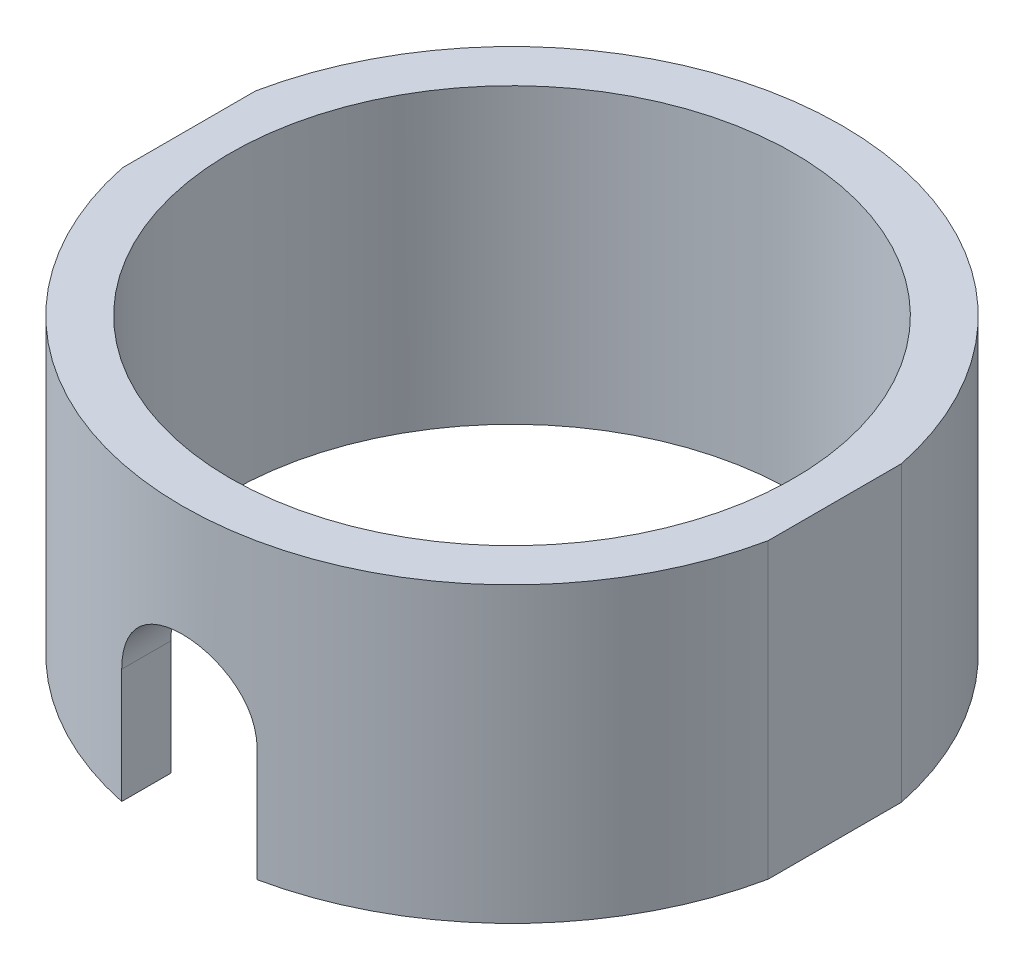
ISO-10303-21;
HEADER;
FILE_DESCRIPTION(('STEP AP214'),'2;1');
FILE_NAME('part.step','',(''),(''),'','','');
FILE_SCHEMA(('AUTOMOTIVE_DESIGN { 1 0 10303 214 1 1 1 1 }'));
ENDSEC;
DATA;
#1=APPLICATION_CONTEXT('core data for automotive mechanical design processes');
#2=APPLICATION_PROTOCOL_DEFINITION('international standard','automotive_design',2000,#1);
#3=PRODUCT_CONTEXT('',#1,'mechanical');
#4=PRODUCT('Part','Part','',(#3));
#5=PRODUCT_RELATED_PRODUCT_CATEGORY('part','',(#4));
#6=PRODUCT_DEFINITION_FORMATION('','',#4);
#7=PRODUCT_DEFINITION_CONTEXT('part definition',#1,'design');
#8=PRODUCT_DEFINITION('design','',#6,#7);
#9=PRODUCT_DEFINITION_SHAPE('','',#8);
#10=(LENGTH_UNIT() NAMED_UNIT(*) SI_UNIT(.MILLI.,.METRE.));
#11=(NAMED_UNIT(*) PLANE_ANGLE_UNIT() SI_UNIT($,.RADIAN.));
#12=(NAMED_UNIT(*) SI_UNIT($,.STERADIAN.) SOLID_ANGLE_UNIT());
#13=UNCERTAINTY_MEASURE_WITH_UNIT(LENGTH_MEASURE(1.E-05),#10,'distance_accuracy_value','');
#14=(GEOMETRIC_REPRESENTATION_CONTEXT(3) GLOBAL_UNCERTAINTY_ASSIGNED_CONTEXT((#13)) GLOBAL_UNIT_ASSIGNED_CONTEXT((#10,
#11,#12)) REPRESENTATION_CONTEXT('',''));
#15=CARTESIAN_POINT('',(0.,0.,0.));
#16=DIRECTION('',(0.,0.,1.));
#17=DIRECTION('',(1.,0.,0.));
#18=AXIS2_PLACEMENT_3D('',#15,#16,#17);
#19=CARTESIAN_POINT('',(9.3213929760978,-1.,-26.4494525696776));
#20=DIRECTION('',(0.,1.,0.));
#21=DIRECTION('',(0.,0.,1.));
#22=AXIS2_PLACEMENT_3D('',#19,#20,#21);
#23=CYLINDRICAL_SURFACE('',#22,61.8379999999992);
#24=CARTESIAN_POINT('',(-3.36060702390209,20.5,34.0741388637453));
#25=CARTESIAN_POINT('',(-3.36064950155537,20.852680188705,34.0741063793221));
#26=CARTESIAN_POINT('',(-3.34589709166775,21.2053491463152,34.077220444574));
#27=CARTESIAN_POINT('',(-3.28711322152507,21.9080886282312,34.0895057874666));
#28=CARTESIAN_POINT('',(-3.24308550092421,22.2581594786467,34.0986762914516));
#29=CARTESIAN_POINT('',(-3.12615296585715,22.9526754168462,34.1228198694794));
#30=CARTESIAN_POINT('',(-3.05329335617662,23.2971284366009,34.1377838592728));
#31=CARTESIAN_POINT('',(-2.879286252857,23.9785311727007,34.1730646666287));
#32=CARTESIAN_POINT('',(-2.77813861917691,24.3154808518912,34.1933815106906));
#33=CARTESIAN_POINT('',(-2.54832553039949,24.9795505259992,34.23878119968));
#34=CARTESIAN_POINT('',(-2.41965832996345,25.30666989596,34.2638643468834));
#35=CARTESIAN_POINT('',(-2.13577155773703,25.9488299868185,34.3180757440793));
#36=CARTESIAN_POINT('',(-1.98055156235535,26.2638705149268,34.3472040586022));
#37=CARTESIAN_POINT('',(-1.6446681595048,26.8797870601849,34.4086847860733));
#38=CARTESIAN_POINT('',(-1.46400243222865,27.180661782542,34.4410374929005));
#39=CARTESIAN_POINT('',(-1.07850384186938,27.7662335453288,34.5080625598193));
#40=CARTESIAN_POINT('',(-0.873670810796976,28.0509304732847,34.5427349360344));
#41=CARTESIAN_POINT('',(-0.438370690769861,28.6059331553279,34.6139122163098));
#42=CARTESIAN_POINT('',(-0.207600545403635,28.8759989318739,34.6504352855071));
#43=CARTESIAN_POINT('',(0.275744508596898,29.3958038397083,34.7238604450772));
#44=CARTESIAN_POINT('',(0.528319632172768,29.6455427705786,34.7607625391829));
#45=CARTESIAN_POINT('',(1.05361374375184,30.1230428281157,34.8339251554352));
#46=CARTESIAN_POINT('',(1.32633581089007,30.3508005829952,34.8701855784587));
#47=CARTESIAN_POINT('',(1.89006223806029,30.7827299633,34.9410536560671));
#48=CARTESIAN_POINT('',(2.18106664031395,30.9869015342517,34.9756613068348));
#49=CARTESIAN_POINT('',(2.7821558705438,31.3719853902891,35.0425703873368));
#50=CARTESIAN_POINT('',(3.0923915615078,31.5526665000159,35.0748476805757));
#51=CARTESIAN_POINT('',(3.72734468449057,31.8872085362844,35.1358263022668));
#52=CARTESIAN_POINT('',(4.05206223403936,32.0410692451107,35.1645276016902));
#53=CARTESIAN_POINT('',(4.71364730221094,32.3207769464343,35.2175322845981));
#54=CARTESIAN_POINT('',(5.05051323381447,32.4466275827688,35.2418362400571));
#55=CARTESIAN_POINT('',(5.73401319880109,32.6693474819698,35.2853528362089));
#56=CARTESIAN_POINT('',(6.08064708110225,32.7662171928185,35.3045655556006));
#57=CARTESIAN_POINT('',(6.77630520773977,32.9290586604753,35.3371182964329));
#58=CARTESIAN_POINT('',(7.12523024131958,32.9954388584784,35.3505357963651));
#59=CARTESIAN_POINT('',(7.82759173012216,33.098717071156,35.371500420591));
#60=CARTESIAN_POINT('',(8.18102814805972,33.1356153293296,35.3790475933692));
#61=CARTESIAN_POINT('',(8.88980488216954,33.1796263248923,35.3880569062075));
#62=CARTESIAN_POINT('',(9.24514507222928,33.1867410114079,35.3895194444642));
#63=CARTESIAN_POINT('',(9.95514008394405,33.1711313488199,35.3863188791738));
#64=CARTESIAN_POINT('',(10.3097949111979,33.1484072445162,35.3816558258816));
#65=CARTESIAN_POINT('',(11.0105172781604,33.0738721421228,35.3664521684393));
#66=CARTESIAN_POINT('',(11.3566338253987,33.0225026248463,35.3560007897737));
#67=CARTESIAN_POINT('',(12.0432332880465,32.8914026255417,35.3295718778549));
#68=CARTESIAN_POINT('',(12.3837162691533,32.8116724744922,35.3135944090932));
#69=CARTESIAN_POINT('',(13.0566868969577,32.6244666684703,35.2765500724081));
#70=CARTESIAN_POINT('',(13.3891743876911,32.5169904727476,35.2554831052945));
#71=CARTESIAN_POINT('',(14.0438752662125,32.2751040137517,35.208832530647));
#72=CARTESIAN_POINT('',(14.36608855047,32.1406934791675,35.1832488776166));
#73=CARTESIAN_POINT('',(15.0001568092434,31.8449524680612,35.1280744498316));
#74=CARTESIAN_POINT('',(15.3119296358711,31.6834506097063,35.098458405957));
#75=CARTESIAN_POINT('',(15.9207880084314,31.335316748802,35.0361546356627));
#76=CARTESIAN_POINT('',(16.2178735118382,31.1486846734961,35.00346690035));
#77=CARTESIAN_POINT('',(16.7954214313767,30.7515777014124,34.9359015054828));
#78=CARTESIAN_POINT('',(17.0758827007352,30.5411011627044,34.9010236951935));
#79=CARTESIAN_POINT('',(17.6183310214544,30.0977420452035,34.8300211880888));
#80=CARTESIAN_POINT('',(17.8803178062241,29.8648591431966,34.7938964732916));
#81=CARTESIAN_POINT('',(18.3886970274974,29.3737973857597,34.7207150160769));
#82=CARTESIAN_POINT('',(18.6347184153402,29.1152349823908,34.6836532835897));
#83=CARTESIAN_POINT('',(19.1041546468559,28.5782353904047,34.6102909303972));
#84=CARTESIAN_POINT('',(19.327569046084,28.2997978112325,34.5739903246664));
#85=CARTESIAN_POINT('',(19.7502970574354,27.7248484481217,34.5031697095937));
#86=CARTESIAN_POINT('',(19.9496035922348,27.4283313948479,34.4686502248311));
#87=CARTESIAN_POINT('',(20.3226113124612,26.8193211967997,34.4023948665266));
#88=CARTESIAN_POINT('',(20.4963133212991,26.5068285662163,34.3706589034834));
#89=CARTESIAN_POINT('',(20.8173140156258,25.8670646988881,34.3108041390385));
#90=CARTESIAN_POINT('',(20.9645333826061,25.5397526238385,34.2826962729423));
#91=CARTESIAN_POINT('',(21.2308067122731,24.8735193554641,34.2310427784558));
#92=CARTESIAN_POINT('',(21.3498612869825,24.534598414584,34.2074970509319));
#93=CARTESIAN_POINT('',(21.5587368230298,23.8480065794509,34.1657023362778));
#94=CARTESIAN_POINT('',(21.6485935740632,23.500346964523,34.1474468675221));
#95=CARTESIAN_POINT('',(21.7985096516323,22.798552982388,34.1167563248932));
#96=CARTESIAN_POINT('',(21.858583127992,22.444421772867,34.1043184872637));
#97=CARTESIAN_POINT('',(21.9367998263939,21.8248371634147,34.0880641240265));
#98=CARTESIAN_POINT('',(21.9617835094049,21.5602628919445,34.0828469433718));
#99=CARTESIAN_POINT('',(21.9950711421148,21.0304670925228,34.0758825490265));
#100=CARTESIAN_POINT('',(22.003402958255,20.7652473908356,34.0741295381983));
#101=CARTESIAN_POINT('',(22.0033929760979,20.5,34.0741388637452));
#102=B_SPLINE_CURVE_WITH_KNOTS('',3,(#24,#25,#26,#27,#28,#29,#30,#31,#32,#33,#34,#35,#36,#37,
#38,#39,#40,#41,#42,#43,#44,#45,#46,#47,#48,#49,#50,#51,#52,#53,#54,#55,#56,#57,#58,#59,#60,#61,
#62,#63,#64,#65,#66,#67,#68,#69,#70,#71,#72,#73,#74,#75,#76,#77,#78,#79,#80,#81,#82,#83,#84,#85,
#86,#87,#88,#89,#90,#91,#92,#93,#94,#95,#96,#97,#98,#99,#100,#101),.UNSPECIFIED.,.F.,.F.,(4,2,2,
2,2,2,2,2,2,2,2,2,2,2,2,2,2,2,2,2,2,2,2,2,2,2,2,2,2,2,2,2,2,2,2,2,2,2,4),(0.,1.05770150115423,
2.11526791652909,3.17118272865903,4.22710276823063,5.28308979595328,6.33909367119135,
7.39519388136924,8.4513014330352,9.52136929047055,10.5914476972548,11.6616899879506,
12.7319347503812,13.8120221534969,14.8921183238435,15.9720739019826,17.0520127854915,
18.1170294833504,19.1820373848606,20.2469755879574,21.3119050542708,22.3608582718154,
23.4097992481096,24.4587606690529,25.507732656772,26.5636097207409,27.6194898417259,
28.675442714879,29.7314108225436,30.8066164976686,31.8818433068247,32.9573850071579,
34.0328921118048,35.1115687102366,36.1902218668029,37.2675478152611,38.3443614421012,
39.1412476427972,39.9367991559645),.UNSPECIFIED.);
#103=CARTESIAN_POINT('',(-3.36060702390209,20.5,34.0741388637453));
#104=VERTEX_POINT('',#103);
#105=CARTESIAN_POINT('',(22.0033929760979,20.5,34.0741388637452));
#106=VERTEX_POINT('',#105);
#107=EDGE_CURVE('E116',#104,#106,#102,.T.);
#108=ORIENTED_EDGE('',*,*,#107,.T.);
#109=DIRECTION('',(0.,1.,0.));
#110=VECTOR('',#109,1.);
#111=CARTESIAN_POINT('',(22.0033929760979,-1.,34.0741388637452));
#112=LINE('',#111,#110);
#113=CARTESIAN_POINT('',(22.0033929760979,-1.,34.0741388637452));
#114=VERTEX_POINT('',#113);
#115=EDGE_CURVE('E103',#106,#114,#112,.F.);
#116=ORIENTED_EDGE('',*,*,#115,.T.);
#117=CARTESIAN_POINT('',(9.3213929760978,-1.,-26.4494525696776));
#118=DIRECTION('',(0.,1.,0.));
#119=DIRECTION('',(0.,0.,1.));
#120=AXIS2_PLACEMENT_3D('',#117,#118,#119);
#121=CIRCLE('',#120,61.8379999999992);
#122=CARTESIAN_POINT('',(69.8828348677825,-1.,-13.9494525696778));
#123=VERTEX_POINT('',#122);
#124=EDGE_CURVE('E113',#114,#123,#121,.T.);
#125=ORIENTED_EDGE('',*,*,#124,.T.);
#126=DIRECTION('',(0.,1.,0.));
#127=VECTOR('',#126,1.);
#128=CARTESIAN_POINT('',(69.8828348677825,-1.,-13.9494525696778));
#129=LINE('',#128,#127);
#130=CARTESIAN_POINT('',(69.8828348677825,54.,-13.9494525696778));
#131=VERTEX_POINT('',#130);
#132=EDGE_CURVE('E136',#123,#131,#129,.T.);
#133=ORIENTED_EDGE('',*,*,#132,.T.);
#134=CARTESIAN_POINT('',(9.3213929760978,54.,-26.4494525696776));
#135=DIRECTION('',(0.,1.,0.));
#136=DIRECTION('',(0.,0.,1.));
#137=AXIS2_PLACEMENT_3D('',#134,#135,#136);
#138=CIRCLE('',#137,61.8379999999992);
#139=CARTESIAN_POINT('',(-51.2400489155867,54.,-13.949452569677));
#140=VERTEX_POINT('',#139);
#141=EDGE_CURVE('E191',#140,#131,#138,.T.);
#142=ORIENTED_EDGE('',*,*,#141,.F.);
#143=DIRECTION('',(0.,1.,0.));
#144=VECTOR('',#143,1.);
#145=CARTESIAN_POINT('',(-51.2400489155867,-1.,-13.949452569677));
#146=LINE('',#145,#144);
#147=CARTESIAN_POINT('',(-51.2400489155867,-1.,-13.949452569677));
#148=VERTEX_POINT('',#147);
#149=EDGE_CURVE('E138',#148,#140,#146,.T.);
#150=ORIENTED_EDGE('',*,*,#149,.F.);
#151=CARTESIAN_POINT('',(-3.36060702390209,-0.999999999999997,34.0741388637453));
#152=VERTEX_POINT('',#151);
#153=EDGE_CURVE('E123',#148,#152,#121,.T.);
#154=ORIENTED_EDGE('',*,*,#153,.T.);
#155=DIRECTION('',(0.,1.,0.));
#156=VECTOR('',#155,1.);
#157=CARTESIAN_POINT('',(-3.36060702390209,-1.,34.0741388637453));
#158=LINE('',#157,#156);
#159=EDGE_CURVE('E164',#152,#104,#158,.T.);
#160=ORIENTED_EDGE('',*,*,#159,.T.);
#161=EDGE_LOOP('',(#108,#116,#125,#133,#142,#150,#154,#160));
#162=FACE_BOUND('',#161,.T.);
#163=ADVANCED_FACE('F35',(#162),#23,.T.);
#164=CARTESIAN_POINT('',(9.3213929760978,-1.,-26.4494525696776));
#165=DIRECTION('',(0.,1.,0.));
#166=DIRECTION('',(0.,0.,1.));
#167=AXIS2_PLACEMENT_3D('',#164,#165,#166);
#168=PLANE('',#167);
#169=DIRECTION('',(0.,0.,-1.));
#170=VECTOR('',#169,1.);
#171=CARTESIAN_POINT('',(22.0033929760979,-1.,53.));
#172=LINE('',#171,#170);
#173=CARTESIAN_POINT('',(22.0033929760979,-1.,24.8440277177819));
#174=VERTEX_POINT('',#173);
#175=EDGE_CURVE('E99',#114,#174,#172,.T.);
#176=ORIENTED_EDGE('',*,*,#175,.T.);
#177=CARTESIAN_POINT('',(9.3213929760978,-1.,-26.4494525696776));
#178=DIRECTION('',(0.,1.,0.));
#179=DIRECTION('',(0.,0.,1.));
#180=AXIS2_PLACEMENT_3D('',#177,#178,#179);
#181=CIRCLE('',#180,52.838);
#182=CARTESIAN_POINT('',(-3.36060702390209,-1.,24.8440277177819));
#183=VERTEX_POINT('',#182);
#184=EDGE_CURVE('E197',#174,#183,#181,.T.);
#185=ORIENTED_EDGE('',*,*,#184,.T.);
#186=DIRECTION('',(0.,0.,-1.));
#187=VECTOR('',#186,1.);
#188=CARTESIAN_POINT('',(-3.36060702390209,-0.999999999999997,53.));
#189=LINE('',#188,#187);
#190=EDGE_CURVE('E50',#152,#183,#189,.T.);
#191=ORIENTED_EDGE('',*,*,#190,.F.);
#192=ORIENTED_EDGE('',*,*,#153,.F.);
#193=DIRECTION('',(0.,0.,1.));
#194=VECTOR('',#193,1.);
#195=CARTESIAN_POINT('',(-51.240048915587,-1.,-38.949452569677));
#196=LINE('',#195,#194);
#197=CARTESIAN_POINT('',(-51.240048915587,-1.,-38.949452569677));
#198=VERTEX_POINT('',#197);
#199=EDGE_CURVE('E124',#198,#148,#196,.T.);
#200=ORIENTED_EDGE('',*,*,#199,.F.);
#201=CARTESIAN_POINT('',(9.3213929760978,-1.,-26.4494525696776));
#202=DIRECTION('',(0.,1.,0.));
#203=DIRECTION('',(0.,0.,1.));
#204=AXIS2_PLACEMENT_3D('',#201,#202,#203);
#205=CIRCLE('',#204,61.8379999999992);
#206=CARTESIAN_POINT('',(69.8828348677828,-1.,-38.9494525696761));
#207=VERTEX_POINT('',#206);
#208=EDGE_CURVE('E128',#207,#198,#205,.T.);
#209=ORIENTED_EDGE('',*,*,#208,.F.);
#210=DIRECTION('',(0.,0.,-1.));
#211=VECTOR('',#210,1.);
#212=CARTESIAN_POINT('',(69.8828348677828,-1.,-38.9494525696761));
#213=LINE('',#212,#211);
#214=EDGE_CURVE('E122',#123,#207,#213,.T.);
#215=ORIENTED_EDGE('',*,*,#214,.F.);
#216=ORIENTED_EDGE('',*,*,#124,.F.);
#217=EDGE_LOOP('',(#176,#185,#191,#192,#200,#209,#215,#216));
#218=FACE_BOUND('',#217,.T.);
#219=ADVANCED_FACE('F120',(#218),#168,.F.);
#220=CARTESIAN_POINT('',(9.3213929760978,-1.,-26.4494525696776));
#221=DIRECTION('',(0.,1.,0.));
#222=DIRECTION('',(0.,0.,1.));
#223=AXIS2_PLACEMENT_3D('',#220,#221,#222);
#224=CYLINDRICAL_SURFACE('',#223,52.838);
#225=CARTESIAN_POINT('',(9.3213929760978,54.,-26.4494525696776));
#226=DIRECTION('',(0.,1.,0.));
#227=DIRECTION('',(0.,0.,1.));
#228=AXIS2_PLACEMENT_3D('',#225,#226,#227);
#229=CIRCLE('',#228,52.838);
#230=CARTESIAN_POINT('',(9.3213929760978,54.,26.3885474303224));
#231=VERTEX_POINT('',#230);
#232=EDGE_CURVE('E117',#231,#231,#229,.T.);
#233=ORIENTED_EDGE('',*,*,#232,.T.);
#234=EDGE_LOOP('',(#233));
#235=FACE_BOUND('',#234,.T.);
#236=DIRECTION('',(0.,1.,0.));
#237=VECTOR('',#236,1.);
#238=CARTESIAN_POINT('',(22.0033929760979,-1.,24.8440277177819));
#239=LINE('',#238,#237);
#240=CARTESIAN_POINT('',(22.0033929760979,20.5,24.8440277177819));
#241=VERTEX_POINT('',#240);
#242=EDGE_CURVE('E11',#241,#174,#239,.F.);
#243=ORIENTED_EDGE('',*,*,#242,.F.);
#244=CARTESIAN_POINT('',(-3.36060702390209,20.5,24.8440277177819));
#245=CARTESIAN_POINT('',(-3.36065101946888,20.8511868133639,24.8439890811889));
#246=CARTESIAN_POINT('',(-3.34602151053389,21.2023601953593,24.8476330724242));
#247=CARTESIAN_POINT('',(-3.28773866298634,21.9020903393696,24.862005251783));
#248=CARTESIAN_POINT('',(-3.24408992336241,22.2506475071536,24.8727323173739));
#249=CARTESIAN_POINT('',(-3.12820045207757,22.9420190001017,24.9009632366419));
#250=CARTESIAN_POINT('',(-3.05601353271495,23.2848428752356,24.9184543345459));
#251=CARTESIAN_POINT('',(-2.88365355195618,23.9629966465458,24.9596806603596));
#252=CARTESIAN_POINT('',(-2.78348016551374,24.298326455634,24.983415960792));
#253=CARTESIAN_POINT('',(-2.55595142255822,24.9591391271391,25.036434323036));
#254=CARTESIAN_POINT('',(-2.42859872466654,25.2846229491162,25.0657168421994));
#255=CARTESIAN_POINT('',(-2.14767233291881,25.9236035166737,25.1289877505773));
#256=CARTESIAN_POINT('',(-1.99409770567236,26.2370998350631,25.1629763072988));
#257=CARTESIAN_POINT('',(-1.66181763027586,26.8501007038242,25.2347056066311));
#258=CARTESIAN_POINT('',(-1.48310747402386,27.1496026188897,25.2724470518014));
#259=CARTESIAN_POINT('',(-1.10182327116924,27.732635666614,25.3506310772145));
#260=CARTESIAN_POINT('',(-0.89924896321203,28.0161666243124,25.3910736870378));
#261=CARTESIAN_POINT('',(-0.467755694895357,28.5703921555311,25.474298602783));
#262=CARTESIAN_POINT('',(-0.238429467154809,28.8407653827642,25.5171098592753));
#263=CARTESIAN_POINT('',(0.242105008132427,29.3614454956151,25.6032165841784));
#264=CARTESIAN_POINT('',(0.493322695557236,29.6117436343628,25.6465122543905));
#265=CARTESIAN_POINT('',(1.01594401249916,30.0905293376023,25.7323822298861));
#266=CARTESIAN_POINT('',(1.28735108666441,30.3190131649514,25.7749564105429));
#267=CARTESIAN_POINT('',(1.84840859695888,30.7524748798033,25.8581867048687));
#268=CARTESIAN_POINT('',(2.13805081004114,30.9574632464984,25.8988436688342));
#269=CARTESIAN_POINT('',(2.73767601504766,31.3451328455914,25.9776541918061));
#270=CARTESIAN_POINT('',(3.04787510426448,31.5274881097925,26.015768163831));
#271=CARTESIAN_POINT('',(3.68303344124229,31.8653605845561,26.08782263214));
#272=CARTESIAN_POINT('',(4.00799285503793,32.0208774931273,26.1217630814613));
#273=CARTESIAN_POINT('',(4.67033948217408,32.303833869737,26.1844962928545));
#274=CARTESIAN_POINT('',(5.0077247558796,32.4312776983895,26.2132898542653));
#275=CARTESIAN_POINT('',(5.69253711741905,32.6570764848349,26.264905399479));
#276=CARTESIAN_POINT('',(6.03996399018927,32.7554320651129,26.287727511069));
#277=CARTESIAN_POINT('',(6.73571477141939,32.9206615231126,26.3263716312762));
#278=CARTESIAN_POINT('',(7.08390009802174,32.9880903459648,26.3423167007082));
#279=CARTESIAN_POINT('',(7.78493662404294,33.0935723423124,26.3673681666625));
#280=CARTESIAN_POINT('',(8.13778777098684,33.1316258458972,26.3764746400298));
#281=CARTESIAN_POINT('',(8.84551523028246,33.1780286823014,26.3875895729072));
#282=CARTESIAN_POINT('',(9.20039134330064,33.1863808900034,26.3895987193901));
#283=CARTESIAN_POINT('',(9.90956122816998,33.1733164928503,26.3864635240268));
#284=CARTESIAN_POINT('',(10.2638550066092,33.1519002271269,26.3813192636744));
#285=CARTESIAN_POINT('',(10.9619921412459,33.0802289619247,26.364201964171));
#286=CARTESIAN_POINT('',(11.3059008210818,33.0305742882835,26.3523711080382));
#287=CARTESIAN_POINT('',(11.9882104071639,32.9032916208858,26.3223101706894));
#288=CARTESIAN_POINT('',(12.3266114013742,32.8256640743474,26.30408019178));
#289=CARTESIAN_POINT('',(12.9955747090379,32.6430528827865,26.2617129786557));
#290=CARTESIAN_POINT('',(13.3261368398752,32.5380686011362,26.2375756069688));
#291=CARTESIAN_POINT('',(13.9771834748906,32.301554729673,26.1840401437446));
#292=CARTESIAN_POINT('',(14.2976678457484,32.1700247888538,26.1546419826459));
#293=CARTESIAN_POINT('',(14.9291144258602,31.8801710139691,26.0910961332652));
#294=CARTESIAN_POINT('',(15.2399727176102,31.7216292234348,26.0569102479602));
#295=CARTESIAN_POINT('',(15.847256636708,31.3796902939923,25.9848955137069));
#296=CARTESIAN_POINT('',(16.1436822143403,31.1962930694744,25.9470666522113));
#297=CARTESIAN_POINT('',(16.7201720822951,30.8059380297359,25.868774979453));
#298=CARTESIAN_POINT('',(17.0002381428429,30.5989827708484,25.8283124541783));
#299=CARTESIAN_POINT('',(17.5423947581177,30.1627824092797,25.7458020959437));
#300=CARTESIAN_POINT('',(17.8044770998991,29.9335272365287,25.7037535520749));
#301=CARTESIAN_POINT('',(18.3151584891569,29.4483197204391,25.6181489425816));
#302=CARTESIAN_POINT('',(18.5632593645694,29.191844790093,25.5745814089536));
#303=CARTESIAN_POINT('',(19.0369330804694,28.6589485171863,25.4882069501232));
#304=CARTESIAN_POINT('',(19.2625151654778,28.3825354406733,25.4453997187804));
#305=CARTESIAN_POINT('',(19.6898327156913,27.8113511682123,25.361715556995));
#306=CARTESIAN_POINT('',(19.8915559887991,27.5165707028054,25.3208396198156));
#307=CARTESIAN_POINT('',(20.269583424711,26.9107507096803,25.2422165614785));
#308=CARTESIAN_POINT('',(20.4458883969442,26.5997117001346,25.2044693407051));
#309=CARTESIAN_POINT('',(20.7725602549178,25.9619470282451,25.1330359112314));
#310=CARTESIAN_POINT('',(20.9227992220339,25.6351535335797,25.0993699616309));
#311=CARTESIAN_POINT('',(21.1951215088198,24.969561096466,25.037325655051));
#312=CARTESIAN_POINT('',(21.3172059667054,24.6307626399871,25.0089470843253));
#313=CARTESIAN_POINT('',(21.5320941026276,23.9440093353726,24.9583796032452));
#314=CARTESIAN_POINT('',(21.6249332797399,23.5960661479172,24.9361831925637));
#315=CARTESIAN_POINT('',(21.7807081597239,22.893331283803,24.8986352652845));
#316=CARTESIAN_POINT('',(21.8436579153464,22.5385429072774,24.8832805322269));
#317=CARTESIAN_POINT('',(21.9286993626344,21.9028743255861,24.86245234385));
#318=CARTESIAN_POINT('',(21.956718899297,21.6228184881029,24.8555515398156));
#319=CARTESIAN_POINT('',(21.9940576657663,21.0618497441801,24.8463356574473));
#320=CARTESIAN_POINT('',(22.0034074651138,20.7809389943202,24.844013082871));
#321=CARTESIAN_POINT('',(22.0033929760979,20.5,24.8440277177819));
#322=B_SPLINE_CURVE_WITH_KNOTS('',3,(#244,#245,#246,#247,#248,#249,#250,#251,#252,#253,#254,
#255,#256,#257,#258,#259,#260,#261,#262,#263,#264,#265,#266,#267,#268,#269,#270,#271,#272,#273,
#274,#275,#276,#277,#278,#279,#280,#281,#282,#283,#284,#285,#286,#287,#288,#289,#290,#291,#292,
#293,#294,#295,#296,#297,#298,#299,#300,#301,#302,#303,#304,#305,#306,#307,#308,#309,#310,#311,
#312,#313,#314,#315,#316,#317,#318,#319,#320,#321),.UNSPECIFIED.,.F.,.F.,(4,2,2,2,2,2,2,2,2,2,2,
2,2,2,2,2,2,2,2,2,2,2,2,2,2,2,2,2,2,2,2,2,2,2,2,2,2,2,4),(0.,1.05321653133337,2.10626618792619,
3.15733958711317,4.20842519440504,5.25940803386405,6.31042829169409,7.36164567753236,
8.41287457712732,9.48295379294859,10.5534967458834,11.6242227722024,12.6944693711001,
13.7786807556922,14.8629043392899,15.9469593906306,17.0309912416436,18.0947270827534,
19.1584509705304,20.2220718942937,21.2856807010586,22.327480816784,23.3692642774006,
24.4110719838785,25.4528934668082,26.5035581904177,27.5542265329264,28.6047809736367,
29.6558120398743,30.7330115758691,31.8097670603271,32.8870704220828,33.9643394702425,
35.0467542096315,36.1291251820513,37.2101772216102,38.2907204913789,39.134701028321,
39.977298507606),.UNSPECIFIED.);
#323=CARTESIAN_POINT('',(-3.36060702390209,20.5,24.8440277177819));
#324=VERTEX_POINT('',#323);
#325=EDGE_CURVE('E43',#324,#241,#322,.T.);
#326=ORIENTED_EDGE('',*,*,#325,.F.);
#327=DIRECTION('',(0.,1.,0.));
#328=VECTOR('',#327,1.);
#329=CARTESIAN_POINT('',(-3.36060702390209,-1.,24.8440277177819));
#330=LINE('',#329,#328);
#331=EDGE_CURVE('E135',#183,#324,#330,.T.);
#332=ORIENTED_EDGE('',*,*,#331,.F.);
#333=ORIENTED_EDGE('',*,*,#184,.F.);
#334=EDGE_LOOP('',(#243,#326,#332,#333));
#335=FACE_BOUND('',#334,.T.);
#336=ADVANCED_FACE('F146',(#235,#335),#224,.F.);
#337=CARTESIAN_POINT('',(9.3213929760978,-1.,-26.4494525696776));
#338=DIRECTION('',(0.,1.,0.));
#339=DIRECTION('',(0.,0.,1.));
#340=AXIS2_PLACEMENT_3D('',#337,#338,#339);
#341=CYLINDRICAL_SURFACE('',#340,61.8379999999992);
#342=DIRECTION('',(0.,1.,0.));
#343=VECTOR('',#342,1.);
#344=CARTESIAN_POINT('',(-51.240048915587,-1.,-38.949452569677));
#345=LINE('',#344,#343);
#346=CARTESIAN_POINT('',(-51.240048915587,54.,-38.949452569677));
#347=VERTEX_POINT('',#346);
#348=EDGE_CURVE('E133',#198,#347,#345,.T.);
#349=ORIENTED_EDGE('',*,*,#348,.T.);
#350=CARTESIAN_POINT('',(9.3213929760978,54.,-26.4494525696776));
#351=DIRECTION('',(0.,1.,0.));
#352=DIRECTION('',(0.,0.,1.));
#353=AXIS2_PLACEMENT_3D('',#350,#351,#352);
#354=CIRCLE('',#353,61.8379999999992);
#355=CARTESIAN_POINT('',(69.8828348677828,54.,-38.9494525696761));
#356=VERTEX_POINT('',#355);
#357=EDGE_CURVE('E193',#356,#347,#354,.T.);
#358=ORIENTED_EDGE('',*,*,#357,.F.);
#359=DIRECTION('',(0.,1.,0.));
#360=VECTOR('',#359,1.);
#361=CARTESIAN_POINT('',(69.8828348677828,-1.,-38.9494525696761));
#362=LINE('',#361,#360);
#363=EDGE_CURVE('E58',#207,#356,#362,.T.);
#364=ORIENTED_EDGE('',*,*,#363,.F.);
#365=ORIENTED_EDGE('',*,*,#208,.T.);
#366=EDGE_LOOP('',(#349,#358,#364,#365));
#367=FACE_BOUND('',#366,.T.);
#368=ADVANCED_FACE('F37',(#367),#341,.T.);
#369=CARTESIAN_POINT('',(69.8828348677828,-1.,-38.9494525696761));
#370=DIRECTION('',(1.,0.,0.));
#371=DIRECTION('',(0.,0.,-1.));
#372=AXIS2_PLACEMENT_3D('',#369,#370,#371);
#373=PLANE('',#372);
#374=ORIENTED_EDGE('',*,*,#363,.T.);
#375=DIRECTION('',(0.,0.,-1.));
#376=VECTOR('',#375,1.);
#377=CARTESIAN_POINT('',(69.8828348677828,54.,-38.9494525696761));
#378=LINE('',#377,#376);
#379=EDGE_CURVE('E195',#131,#356,#378,.T.);
#380=ORIENTED_EDGE('',*,*,#379,.F.);
#381=ORIENTED_EDGE('',*,*,#132,.F.);
#382=ORIENTED_EDGE('',*,*,#214,.T.);
#383=EDGE_LOOP('',(#374,#380,#381,#382));
#384=FACE_BOUND('',#383,.T.);
#385=ADVANCED_FACE('F170',(#384),#373,.T.);
#386=CARTESIAN_POINT('',(-51.240048915587,-1.,-38.949452569677));
#387=DIRECTION('',(-1.,0.,0.));
#388=DIRECTION('',(0.,0.,1.));
#389=AXIS2_PLACEMENT_3D('',#386,#387,#388);
#390=PLANE('',#389);
#391=ORIENTED_EDGE('',*,*,#149,.T.);
#392=DIRECTION('',(0.,0.,1.));
#393=VECTOR('',#392,1.);
#394=CARTESIAN_POINT('',(-51.240048915587,54.,-38.949452569677));
#395=LINE('',#394,#393);
#396=EDGE_CURVE('E183',#347,#140,#395,.T.);
#397=ORIENTED_EDGE('',*,*,#396,.F.);
#398=ORIENTED_EDGE('',*,*,#348,.F.);
#399=ORIENTED_EDGE('',*,*,#199,.T.);
#400=EDGE_LOOP('',(#391,#397,#398,#399));
#401=FACE_BOUND('',#400,.T.);
#402=ADVANCED_FACE('F171',(#401),#390,.T.);
#403=CARTESIAN_POINT('',(9.3213929760978,54.,-26.4494525696776));
#404=DIRECTION('',(0.,1.,0.));
#405=DIRECTION('',(0.,0.,1.));
#406=AXIS2_PLACEMENT_3D('',#403,#404,#405);
#407=PLANE('',#406);
#408=ORIENTED_EDGE('',*,*,#357,.T.);
#409=ORIENTED_EDGE('',*,*,#396,.T.);
#410=ORIENTED_EDGE('',*,*,#141,.T.);
#411=ORIENTED_EDGE('',*,*,#379,.T.);
#412=EDGE_LOOP('',(#408,#409,#410,#411));
#413=FACE_BOUND('',#412,.T.);
#414=ORIENTED_EDGE('',*,*,#232,.F.);
#415=EDGE_LOOP('',(#414));
#416=FACE_BOUND('',#415,.T.);
#417=ADVANCED_FACE('F173',(#413,#416),#407,.T.);
#418=CARTESIAN_POINT('',(22.0033929760979,-17.1578779196763,53.));
#419=DIRECTION('',(-1.,0.,0.));
#420=DIRECTION('',(0.,0.,1.));
#421=AXIS2_PLACEMENT_3D('',#418,#419,#420);
#422=PLANE('',#421);
#423=DIRECTION('',(0.,0.,-1.));
#424=VECTOR('',#423,1.);
#425=CARTESIAN_POINT('',(22.0033929760979,20.5,53.));
#426=LINE('',#425,#424);
#427=EDGE_CURVE('E210',#106,#241,#426,.T.);
#428=ORIENTED_EDGE('',*,*,#427,.T.);
#429=ORIENTED_EDGE('',*,*,#242,.T.);
#430=ORIENTED_EDGE('',*,*,#175,.F.);
#431=ORIENTED_EDGE('',*,*,#115,.F.);
#432=EDGE_LOOP('',(#428,#429,#430,#431));
#433=FACE_BOUND('',#432,.T.);
#434=ADVANCED_FACE('F102',(#433),#422,.T.);
#435=CARTESIAN_POINT('',(9.32139297609791,20.5,53.));
#436=DIRECTION('',(0.,0.,-1.));
#437=DIRECTION('',(-1.,0.,0.));
#438=AXIS2_PLACEMENT_3D('',#435,#436,#437);
#439=CYLINDRICAL_SURFACE('',#438,12.682);
#440=DIRECTION('',(0.,0.,-1.));
#441=VECTOR('',#440,1.);
#442=CARTESIAN_POINT('',(-3.36060702390209,20.5,53.));
#443=LINE('',#442,#441);
#444=EDGE_CURVE('E207',#104,#324,#443,.T.);
#445=ORIENTED_EDGE('',*,*,#444,.T.);
#446=ORIENTED_EDGE('',*,*,#325,.T.);
#447=ORIENTED_EDGE('',*,*,#427,.F.);
#448=ORIENTED_EDGE('',*,*,#107,.F.);
#449=EDGE_LOOP('',(#445,#446,#447,#448));
#450=FACE_BOUND('',#449,.T.);
#451=ADVANCED_FACE('F150',(#450),#439,.F.);
#452=CARTESIAN_POINT('',(-3.36060702390208,-17.1578779196763,53.));
#453=DIRECTION('',(1.,0.,0.));
#454=DIRECTION('',(0.,1.,0.));
#455=AXIS2_PLACEMENT_3D('',#452,#453,#454);
#456=PLANE('',#455);
#457=ORIENTED_EDGE('',*,*,#190,.T.);
#458=ORIENTED_EDGE('',*,*,#331,.T.);
#459=ORIENTED_EDGE('',*,*,#444,.F.);
#460=ORIENTED_EDGE('',*,*,#159,.F.);
#461=EDGE_LOOP('',(#457,#458,#459,#460));
#462=FACE_BOUND('',#461,.T.);
#463=ADVANCED_FACE('F155',(#462),#456,.T.);
#464=CLOSED_SHELL('',(#163,#219,#336,#368,#385,#402,#417,#434,#451,#463));
#465=MANIFOLD_SOLID_BREP('B2',#464);
#466=ADVANCED_BREP_SHAPE_REPRESENTATION('',(#18,#465),#14);
#467=SHAPE_DEFINITION_REPRESENTATION(#9,#466);
ENDSEC;
END-ISO-10303-21;
